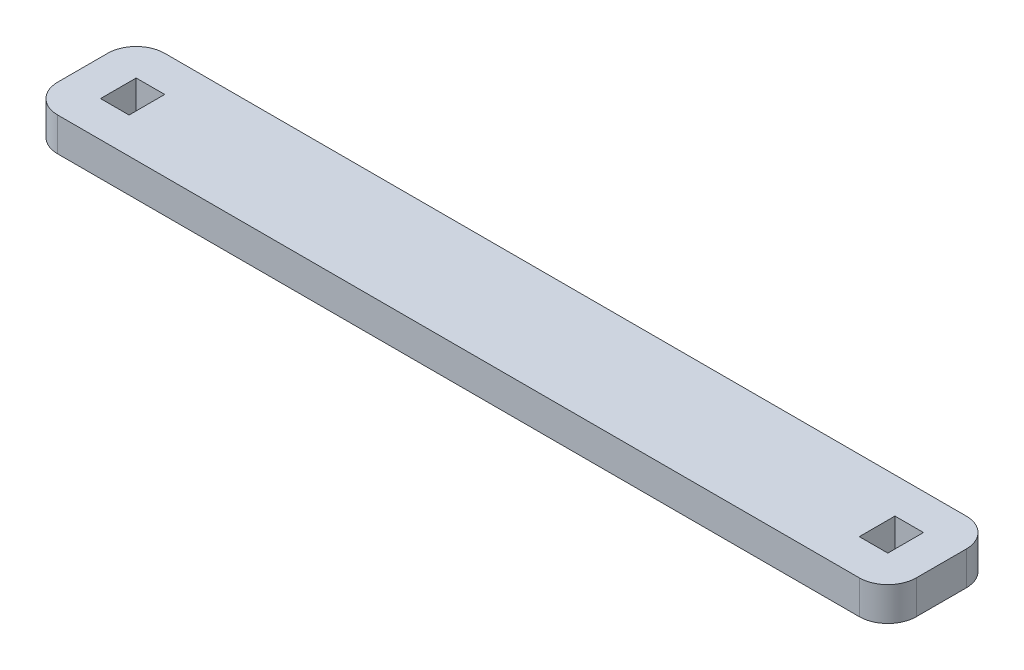
ISO-10303-21;
HEADER;
FILE_DESCRIPTION(('STEP AP214'),'2;1');
FILE_NAME('part.step','',(''),(''),'','','');
FILE_SCHEMA(('AUTOMOTIVE_DESIGN { 1 0 10303 214 1 1 1 1 }'));
ENDSEC;
DATA;
#1=APPLICATION_CONTEXT('core data for automotive mechanical design processes');
#2=APPLICATION_PROTOCOL_DEFINITION('international standard','automotive_design',2000,#1);
#3=PRODUCT_CONTEXT('',#1,'mechanical');
#4=PRODUCT('Part','Part','',(#3));
#5=PRODUCT_RELATED_PRODUCT_CATEGORY('part','',(#4));
#6=PRODUCT_DEFINITION_FORMATION('','',#4);
#7=PRODUCT_DEFINITION_CONTEXT('part definition',#1,'design');
#8=PRODUCT_DEFINITION('design','',#6,#7);
#9=PRODUCT_DEFINITION_SHAPE('','',#8);
#10=(LENGTH_UNIT() NAMED_UNIT(*) SI_UNIT(.MILLI.,.METRE.));
#11=(NAMED_UNIT(*) PLANE_ANGLE_UNIT() SI_UNIT($,.RADIAN.));
#12=(NAMED_UNIT(*) SI_UNIT($,.STERADIAN.) SOLID_ANGLE_UNIT());
#13=UNCERTAINTY_MEASURE_WITH_UNIT(LENGTH_MEASURE(1.E-05),#10,'distance_accuracy_value','');
#14=(GEOMETRIC_REPRESENTATION_CONTEXT(3) GLOBAL_UNCERTAINTY_ASSIGNED_CONTEXT((#13)) GLOBAL_UNIT_ASSIGNED_CONTEXT((#10,
#11,#12)) REPRESENTATION_CONTEXT('',''));
#15=CARTESIAN_POINT('',(0.,0.,0.));
#16=DIRECTION('',(0.,0.,1.));
#17=DIRECTION('',(1.,0.,0.));
#18=AXIS2_PLACEMENT_3D('',#15,#16,#17);
#19=CARTESIAN_POINT('',(0.,1.5,0.));
#20=DIRECTION('',(0.,1.,0.));
#21=DIRECTION('',(0.,0.,1.));
#22=AXIS2_PLACEMENT_3D('',#19,#20,#21);
#23=PLANE('',#22);
#24=DIRECTION('',(-1.,0.,0.));
#25=VECTOR('',#24,1.);
#26=CARTESIAN_POINT('',(38.227,1.5,-4.7625));
#27=LINE('',#26,#25);
#28=CARTESIAN_POINT('',(35.687,1.5,-4.7625));
#29=VERTEX_POINT('',#28);
#30=CARTESIAN_POINT('',(-35.687,1.5,-4.7625));
#31=VERTEX_POINT('',#30);
#32=EDGE_CURVE('E268',#29,#31,#27,.T.);
#33=ORIENTED_EDGE('',*,*,#32,.T.);
#34=CARTESIAN_POINT('',(-35.687,1.5,-2.2225));
#35=DIRECTION('',(0.,1.,0.));
#36=DIRECTION('',(0.,0.,1.));
#37=AXIS2_PLACEMENT_3D('',#34,#35,#36);
#38=CIRCLE('',#37,2.54);
#39=CARTESIAN_POINT('',(-38.227,1.5,-2.2225));
#40=VERTEX_POINT('',#39);
#41=EDGE_CURVE('E319',#31,#40,#38,.T.);
#42=ORIENTED_EDGE('',*,*,#41,.T.);
#43=DIRECTION('',(0.,0.,1.));
#44=VECTOR('',#43,1.);
#45=CARTESIAN_POINT('',(-38.227,1.5,4.7625));
#46=LINE('',#45,#44);
#47=CARTESIAN_POINT('',(-38.227,1.5,2.2225));
#48=VERTEX_POINT('',#47);
#49=EDGE_CURVE('E257',#40,#48,#46,.T.);
#50=ORIENTED_EDGE('',*,*,#49,.T.);
#51=CARTESIAN_POINT('',(-35.687,1.5,2.2225));
#52=DIRECTION('',(0.,1.,0.));
#53=DIRECTION('',(0.,0.,1.));
#54=AXIS2_PLACEMENT_3D('',#51,#52,#53);
#55=CIRCLE('',#54,2.54);
#56=CARTESIAN_POINT('',(-35.687,1.5,4.7625));
#57=VERTEX_POINT('',#56);
#58=EDGE_CURVE('E311',#48,#57,#55,.T.);
#59=ORIENTED_EDGE('',*,*,#58,.T.);
#60=DIRECTION('',(1.,0.,0.));
#61=VECTOR('',#60,1.);
#62=CARTESIAN_POINT('',(38.227,1.5,4.7625));
#63=LINE('',#62,#61);
#64=CARTESIAN_POINT('',(35.687,1.5,4.7625));
#65=VERTEX_POINT('',#64);
#66=EDGE_CURVE('E261',#57,#65,#63,.T.);
#67=ORIENTED_EDGE('',*,*,#66,.T.);
#68=CARTESIAN_POINT('',(35.687,1.5,2.2225));
#69=DIRECTION('',(0.,1.,0.));
#70=DIRECTION('',(0.,0.,1.));
#71=AXIS2_PLACEMENT_3D('',#68,#69,#70);
#72=CIRCLE('',#71,2.54);
#73=CARTESIAN_POINT('',(38.227,1.5,2.2225));
#74=VERTEX_POINT('',#73);
#75=EDGE_CURVE('E68',#65,#74,#72,.T.);
#76=ORIENTED_EDGE('',*,*,#75,.T.);
#77=DIRECTION('',(0.,0.,-1.));
#78=VECTOR('',#77,1.);
#79=CARTESIAN_POINT('',(38.227,1.5,4.7625));
#80=LINE('',#79,#78);
#81=CARTESIAN_POINT('',(38.227,1.5,-2.2225));
#82=VERTEX_POINT('',#81);
#83=EDGE_CURVE('E265',#74,#82,#80,.T.);
#84=ORIENTED_EDGE('',*,*,#83,.T.);
#85=CARTESIAN_POINT('',(35.687,1.5,-2.2225));
#86=DIRECTION('',(0.,1.,0.));
#87=DIRECTION('',(0.,0.,1.));
#88=AXIS2_PLACEMENT_3D('',#85,#86,#87);
#89=CIRCLE('',#88,2.54);
#90=EDGE_CURVE('E316',#82,#29,#89,.T.);
#91=ORIENTED_EDGE('',*,*,#90,.T.);
#92=EDGE_LOOP('',(#33,#42,#50,#59,#67,#76,#84,#91));
#93=FACE_BOUND('',#92,.T.);
#94=DIRECTION('',(1.,0.,0.));
#95=VECTOR('',#94,1.);
#96=CARTESIAN_POINT('',(-32.512,1.5,1.5875));
#97=LINE('',#96,#95);
#98=CARTESIAN_POINT('',(-35.052,1.5,1.5875));
#99=VERTEX_POINT('',#98);
#100=CARTESIAN_POINT('',(-32.512,1.5,1.5875));
#101=VERTEX_POINT('',#100);
#102=EDGE_CURVE('E217',#99,#101,#97,.T.);
#103=ORIENTED_EDGE('',*,*,#102,.F.);
#104=DIRECTION('',(0.,0.,1.));
#105=VECTOR('',#104,1.);
#106=CARTESIAN_POINT('',(-35.052,1.5,1.5875));
#107=LINE('',#106,#105);
#108=CARTESIAN_POINT('',(-35.052,1.5,-1.5875));
#109=VERTEX_POINT('',#108);
#110=EDGE_CURVE('E214',#109,#99,#107,.T.);
#111=ORIENTED_EDGE('',*,*,#110,.F.);
#112=DIRECTION('',(-1.,0.,0.));
#113=VECTOR('',#112,1.);
#114=CARTESIAN_POINT('',(-32.512,1.5,-1.5875));
#115=LINE('',#114,#113);
#116=CARTESIAN_POINT('',(-32.512,1.5,-1.5875));
#117=VERTEX_POINT('',#116);
#118=EDGE_CURVE('E225',#117,#109,#115,.T.);
#119=ORIENTED_EDGE('',*,*,#118,.F.);
#120=DIRECTION('',(0.,0.,-1.));
#121=VECTOR('',#120,1.);
#122=CARTESIAN_POINT('',(-32.512,1.5,1.5875));
#123=LINE('',#122,#121);
#124=EDGE_CURVE('E221',#101,#117,#123,.T.);
#125=ORIENTED_EDGE('',*,*,#124,.F.);
#126=EDGE_LOOP('',(#103,#111,#119,#125));
#127=FACE_BOUND('',#126,.T.);
#128=DIRECTION('',(1.,0.,0.));
#129=VECTOR('',#128,1.);
#130=CARTESIAN_POINT('',(35.052,1.5,1.5875));
#131=LINE('',#130,#129);
#132=CARTESIAN_POINT('',(32.512,1.5,1.5875));
#133=VERTEX_POINT('',#132);
#134=CARTESIAN_POINT('',(35.052,1.5,1.5875));
#135=VERTEX_POINT('',#134);
#136=EDGE_CURVE('E172',#133,#135,#131,.T.);
#137=ORIENTED_EDGE('',*,*,#136,.F.);
#138=DIRECTION('',(0.,0.,1.));
#139=VECTOR('',#138,1.);
#140=CARTESIAN_POINT('',(32.512,1.5,1.5875));
#141=LINE('',#140,#139);
#142=CARTESIAN_POINT('',(32.512,1.5,-1.5875));
#143=VERTEX_POINT('',#142);
#144=EDGE_CURVE('E161',#143,#133,#141,.T.);
#145=ORIENTED_EDGE('',*,*,#144,.F.);
#146=DIRECTION('',(-1.,0.,0.));
#147=VECTOR('',#146,1.);
#148=CARTESIAN_POINT('',(35.052,1.5,-1.5875));
#149=LINE('',#148,#147);
#150=CARTESIAN_POINT('',(35.052,1.5,-1.5875));
#151=VERTEX_POINT('',#150);
#152=EDGE_CURVE('E190',#151,#143,#149,.T.);
#153=ORIENTED_EDGE('',*,*,#152,.F.);
#154=DIRECTION('',(0.,0.,-1.));
#155=VECTOR('',#154,1.);
#156=CARTESIAN_POINT('',(35.052,1.5,1.5875));
#157=LINE('',#156,#155);
#158=EDGE_CURVE('E186',#135,#151,#157,.T.);
#159=ORIENTED_EDGE('',*,*,#158,.F.);
#160=EDGE_LOOP('',(#137,#145,#153,#159));
#161=FACE_BOUND('',#160,.T.);
#162=ADVANCED_FACE('F45',(#93,#127,#161),#23,.T.);
#163=CARTESIAN_POINT('',(0.,-1.5,0.));
#164=DIRECTION('',(0.,1.,0.));
#165=DIRECTION('',(0.,0.,1.));
#166=AXIS2_PLACEMENT_3D('',#163,#164,#165);
#167=PLANE('',#166);
#168=DIRECTION('',(0.,0.,1.));
#169=VECTOR('',#168,1.);
#170=CARTESIAN_POINT('',(-35.052,-1.5,1.5875));
#171=LINE('',#170,#169);
#172=CARTESIAN_POINT('',(-35.052,-1.5,-1.5875));
#173=VERTEX_POINT('',#172);
#174=CARTESIAN_POINT('',(-35.052,-1.5,1.5875));
#175=VERTEX_POINT('',#174);
#176=EDGE_CURVE('E181',#173,#175,#171,.T.);
#177=ORIENTED_EDGE('',*,*,#176,.T.);
#178=DIRECTION('',(1.,0.,0.));
#179=VECTOR('',#178,1.);
#180=CARTESIAN_POINT('',(-32.512,-1.5,1.5875));
#181=LINE('',#180,#179);
#182=CARTESIAN_POINT('',(-32.512,-1.5,1.5875));
#183=VERTEX_POINT('',#182);
#184=EDGE_CURVE('E232',#175,#183,#181,.T.);
#185=ORIENTED_EDGE('',*,*,#184,.T.);
#186=DIRECTION('',(0.,0.,-1.));
#187=VECTOR('',#186,1.);
#188=CARTESIAN_POINT('',(-32.512,-1.5,1.5875));
#189=LINE('',#188,#187);
#190=CARTESIAN_POINT('',(-32.512,-1.5,-1.5875));
#191=VERTEX_POINT('',#190);
#192=EDGE_CURVE('E236',#183,#191,#189,.T.);
#193=ORIENTED_EDGE('',*,*,#192,.T.);
#194=DIRECTION('',(-1.,0.,0.));
#195=VECTOR('',#194,1.);
#196=CARTESIAN_POINT('',(-32.512,-1.5,-1.5875));
#197=LINE('',#196,#195);
#198=EDGE_CURVE('E218',#191,#173,#197,.T.);
#199=ORIENTED_EDGE('',*,*,#198,.T.);
#200=EDGE_LOOP('',(#177,#185,#193,#199));
#201=FACE_BOUND('',#200,.T.);
#202=DIRECTION('',(0.,0.,1.));
#203=VECTOR('',#202,1.);
#204=CARTESIAN_POINT('',(-38.227,-1.5,4.7625));
#205=LINE('',#204,#203);
#206=CARTESIAN_POINT('',(-38.227,-1.5,-2.2225));
#207=VERTEX_POINT('',#206);
#208=CARTESIAN_POINT('',(-38.227,-1.5,2.2225));
#209=VERTEX_POINT('',#208);
#210=EDGE_CURVE('E256',#207,#209,#205,.T.);
#211=ORIENTED_EDGE('',*,*,#210,.F.);
#212=CARTESIAN_POINT('',(-35.687,-1.5,-2.2225));
#213=DIRECTION('',(0.,1.,0.));
#214=DIRECTION('',(0.,0.,1.));
#215=AXIS2_PLACEMENT_3D('',#212,#213,#214);
#216=CIRCLE('',#215,2.54);
#217=CARTESIAN_POINT('',(-35.687,-1.5,-4.7625));
#218=VERTEX_POINT('',#217);
#219=EDGE_CURVE('E301',#207,#218,#216,.F.);
#220=ORIENTED_EDGE('',*,*,#219,.T.);
#221=DIRECTION('',(-1.,0.,0.));
#222=VECTOR('',#221,1.);
#223=CARTESIAN_POINT('',(38.227,-1.5,-4.7625));
#224=LINE('',#223,#222);
#225=CARTESIAN_POINT('',(35.687,-1.5,-4.7625));
#226=VERTEX_POINT('',#225);
#227=EDGE_CURVE('E262',#226,#218,#224,.T.);
#228=ORIENTED_EDGE('',*,*,#227,.F.);
#229=CARTESIAN_POINT('',(35.687,-1.5,-2.2225));
#230=DIRECTION('',(0.,1.,0.));
#231=DIRECTION('',(0.,0.,1.));
#232=AXIS2_PLACEMENT_3D('',#229,#230,#231);
#233=CIRCLE('',#232,2.54);
#234=CARTESIAN_POINT('',(38.227,-1.5,-2.2225));
#235=VERTEX_POINT('',#234);
#236=EDGE_CURVE('E298',#226,#235,#233,.F.);
#237=ORIENTED_EDGE('',*,*,#236,.T.);
#238=DIRECTION('',(0.,0.,-1.));
#239=VECTOR('',#238,1.);
#240=CARTESIAN_POINT('',(38.227,-1.5,4.7625));
#241=LINE('',#240,#239);
#242=CARTESIAN_POINT('',(38.227,-1.5,2.2225));
#243=VERTEX_POINT('',#242);
#244=EDGE_CURVE('E280',#243,#235,#241,.T.);
#245=ORIENTED_EDGE('',*,*,#244,.F.);
#246=CARTESIAN_POINT('',(35.687,-1.5,2.2225));
#247=DIRECTION('',(0.,1.,0.));
#248=DIRECTION('',(0.,0.,1.));
#249=AXIS2_PLACEMENT_3D('',#246,#247,#248);
#250=CIRCLE('',#249,2.54);
#251=CARTESIAN_POINT('',(35.687,-1.5,4.7625));
#252=VERTEX_POINT('',#251);
#253=EDGE_CURVE('E295',#243,#252,#250,.F.);
#254=ORIENTED_EDGE('',*,*,#253,.T.);
#255=DIRECTION('',(1.,0.,0.));
#256=VECTOR('',#255,1.);
#257=CARTESIAN_POINT('',(38.227,-1.5,4.7625));
#258=LINE('',#257,#256);
#259=CARTESIAN_POINT('',(-35.687,-1.5,4.7625));
#260=VERTEX_POINT('',#259);
#261=EDGE_CURVE('E276',#260,#252,#258,.T.);
#262=ORIENTED_EDGE('',*,*,#261,.F.);
#263=CARTESIAN_POINT('',(-35.687,-1.5,2.2225));
#264=DIRECTION('',(0.,1.,0.));
#265=DIRECTION('',(0.,0.,1.));
#266=AXIS2_PLACEMENT_3D('',#263,#264,#265);
#267=CIRCLE('',#266,2.54);
#268=EDGE_CURVE('E292',#260,#209,#267,.F.);
#269=ORIENTED_EDGE('',*,*,#268,.T.);
#270=EDGE_LOOP('',(#211,#220,#228,#237,#245,#254,#262,#269));
#271=FACE_BOUND('',#270,.T.);
#272=DIRECTION('',(0.,0.,1.));
#273=VECTOR('',#272,1.);
#274=CARTESIAN_POINT('',(32.512,-1.5,1.5875));
#275=LINE('',#274,#273);
#276=CARTESIAN_POINT('',(32.512,-1.5,-1.5875));
#277=VERTEX_POINT('',#276);
#278=CARTESIAN_POINT('',(32.512,-1.5,1.5875));
#279=VERTEX_POINT('',#278);
#280=EDGE_CURVE('E195',#277,#279,#275,.T.);
#281=ORIENTED_EDGE('',*,*,#280,.T.);
#282=DIRECTION('',(1.,0.,0.));
#283=VECTOR('',#282,1.);
#284=CARTESIAN_POINT('',(35.052,-1.5,1.5875));
#285=LINE('',#284,#283);
#286=CARTESIAN_POINT('',(35.052,-1.5,1.5875));
#287=VERTEX_POINT('',#286);
#288=EDGE_CURVE('E179',#279,#287,#285,.T.);
#289=ORIENTED_EDGE('',*,*,#288,.T.);
#290=DIRECTION('',(0.,0.,-1.));
#291=VECTOR('',#290,1.);
#292=CARTESIAN_POINT('',(35.052,-1.5,1.5875));
#293=LINE('',#292,#291);
#294=CARTESIAN_POINT('',(35.052,-1.5,-1.5875));
#295=VERTEX_POINT('',#294);
#296=EDGE_CURVE('E200',#287,#295,#293,.T.);
#297=ORIENTED_EDGE('',*,*,#296,.T.);
#298=DIRECTION('',(-1.,0.,0.));
#299=VECTOR('',#298,1.);
#300=CARTESIAN_POINT('',(35.052,-1.5,-1.5875));
#301=LINE('',#300,#299);
#302=EDGE_CURVE('E173',#295,#277,#301,.T.);
#303=ORIENTED_EDGE('',*,*,#302,.T.);
#304=EDGE_LOOP('',(#281,#289,#297,#303));
#305=FACE_BOUND('',#304,.T.);
#306=ADVANCED_FACE('F339',(#201,#271,#305),#167,.F.);
#307=CARTESIAN_POINT('',(-38.227,1.5,4.7625));
#308=DIRECTION('',(1.,0.,0.));
#309=DIRECTION('',(0.,0.,-1.));
#310=AXIS2_PLACEMENT_3D('',#307,#308,#309);
#311=PLANE('',#310);
#312=ORIENTED_EDGE('',*,*,#49,.F.);
#313=DIRECTION('',(0.,-1.,0.));
#314=VECTOR('',#313,1.);
#315=CARTESIAN_POINT('',(-38.227,1.5,-2.2225));
#316=LINE('',#315,#314);
#317=EDGE_CURVE('E288',#40,#207,#316,.T.);
#318=ORIENTED_EDGE('',*,*,#317,.T.);
#319=ORIENTED_EDGE('',*,*,#210,.T.);
#320=DIRECTION('',(0.,-1.,0.));
#321=VECTOR('',#320,1.);
#322=CARTESIAN_POINT('',(-38.227,1.5,2.2225));
#323=LINE('',#322,#321);
#324=EDGE_CURVE('E272',#209,#48,#323,.F.);
#325=ORIENTED_EDGE('',*,*,#324,.T.);
#326=EDGE_LOOP('',(#312,#318,#319,#325));
#327=FACE_BOUND('',#326,.T.);
#328=ADVANCED_FACE('F362',(#327),#311,.F.);
#329=CARTESIAN_POINT('',(38.227,1.5,4.7625));
#330=DIRECTION('',(0.,0.,-1.));
#331=DIRECTION('',(-1.,0.,0.));
#332=AXIS2_PLACEMENT_3D('',#329,#330,#331);
#333=PLANE('',#332);
#334=ORIENTED_EDGE('',*,*,#261,.T.);
#335=DIRECTION('',(0.,-1.,0.));
#336=VECTOR('',#335,1.);
#337=CARTESIAN_POINT('',(35.687,1.5,4.7625));
#338=LINE('',#337,#336);
#339=EDGE_CURVE('E11',#252,#65,#338,.F.);
#340=ORIENTED_EDGE('',*,*,#339,.T.);
#341=ORIENTED_EDGE('',*,*,#66,.F.);
#342=DIRECTION('',(0.,-1.,0.));
#343=VECTOR('',#342,1.);
#344=CARTESIAN_POINT('',(-35.687,1.5,4.7625));
#345=LINE('',#344,#343);
#346=EDGE_CURVE('E54',#57,#260,#345,.T.);
#347=ORIENTED_EDGE('',*,*,#346,.T.);
#348=EDGE_LOOP('',(#334,#340,#341,#347));
#349=FACE_BOUND('',#348,.T.);
#350=ADVANCED_FACE('F333',(#349),#333,.F.);
#351=CARTESIAN_POINT('',(38.227,1.5,4.7625));
#352=DIRECTION('',(-1.,0.,0.));
#353=DIRECTION('',(0.,0.,1.));
#354=AXIS2_PLACEMENT_3D('',#351,#352,#353);
#355=PLANE('',#354);
#356=ORIENTED_EDGE('',*,*,#244,.T.);
#357=DIRECTION('',(0.,-1.,0.));
#358=VECTOR('',#357,1.);
#359=CARTESIAN_POINT('',(38.227,1.5,-2.2225));
#360=LINE('',#359,#358);
#361=EDGE_CURVE('E61',#235,#82,#360,.F.);
#362=ORIENTED_EDGE('',*,*,#361,.T.);
#363=ORIENTED_EDGE('',*,*,#83,.F.);
#364=DIRECTION('',(0.,-1.,0.));
#365=VECTOR('',#364,1.);
#366=CARTESIAN_POINT('',(38.227,1.5,2.2225));
#367=LINE('',#366,#365);
#368=EDGE_CURVE('E322',#74,#243,#367,.T.);
#369=ORIENTED_EDGE('',*,*,#368,.T.);
#370=EDGE_LOOP('',(#356,#362,#363,#369));
#371=FACE_BOUND('',#370,.T.);
#372=ADVANCED_FACE('F345',(#371),#355,.F.);
#373=CARTESIAN_POINT('',(38.227,1.5,-4.7625));
#374=DIRECTION('',(0.,0.,1.));
#375=DIRECTION('',(1.,0.,0.));
#376=AXIS2_PLACEMENT_3D('',#373,#374,#375);
#377=PLANE('',#376);
#378=ORIENTED_EDGE('',*,*,#227,.T.);
#379=DIRECTION('',(0.,-1.,0.));
#380=VECTOR('',#379,1.);
#381=CARTESIAN_POINT('',(-35.687,1.5,-4.7625));
#382=LINE('',#381,#380);
#383=EDGE_CURVE('E308',#218,#31,#382,.F.);
#384=ORIENTED_EDGE('',*,*,#383,.T.);
#385=ORIENTED_EDGE('',*,*,#32,.F.);
#386=DIRECTION('',(0.,-1.,0.));
#387=VECTOR('',#386,1.);
#388=CARTESIAN_POINT('',(35.687,1.5,-4.7625));
#389=LINE('',#388,#387);
#390=EDGE_CURVE('E304',#29,#226,#389,.T.);
#391=ORIENTED_EDGE('',*,*,#390,.T.);
#392=EDGE_LOOP('',(#378,#384,#385,#391));
#393=FACE_BOUND('',#392,.T.);
#394=ADVANCED_FACE('F354',(#393),#377,.F.);
#395=CARTESIAN_POINT('',(-35.052,1.5,1.5875));
#396=DIRECTION('',(1.,0.,0.));
#397=DIRECTION('',(0.,0.,-1.));
#398=AXIS2_PLACEMENT_3D('',#395,#396,#397);
#399=PLANE('',#398);
#400=ORIENTED_EDGE('',*,*,#176,.F.);
#401=DIRECTION('',(0.,-1.,0.));
#402=VECTOR('',#401,1.);
#403=CARTESIAN_POINT('',(-35.052,1.5,-1.5875));
#404=LINE('',#403,#402);
#405=EDGE_CURVE('E228',#109,#173,#404,.T.);
#406=ORIENTED_EDGE('',*,*,#405,.F.);
#407=ORIENTED_EDGE('',*,*,#110,.T.);
#408=DIRECTION('',(0.,-1.,0.));
#409=VECTOR('',#408,1.);
#410=CARTESIAN_POINT('',(-35.052,1.5,1.5875));
#411=LINE('',#410,#409);
#412=EDGE_CURVE('E252',#99,#175,#411,.T.);
#413=ORIENTED_EDGE('',*,*,#412,.T.);
#414=EDGE_LOOP('',(#400,#406,#407,#413));
#415=FACE_BOUND('',#414,.T.);
#416=ADVANCED_FACE('F377',(#415),#399,.T.);
#417=CARTESIAN_POINT('',(-32.512,1.5,1.5875));
#418=DIRECTION('',(0.,0.,-1.));
#419=DIRECTION('',(-1.,0.,0.));
#420=AXIS2_PLACEMENT_3D('',#417,#418,#419);
#421=PLANE('',#420);
#422=ORIENTED_EDGE('',*,*,#184,.F.);
#423=ORIENTED_EDGE('',*,*,#412,.F.);
#424=ORIENTED_EDGE('',*,*,#102,.T.);
#425=DIRECTION('',(0.,-1.,0.));
#426=VECTOR('',#425,1.);
#427=CARTESIAN_POINT('',(-32.512,1.5,1.5875));
#428=LINE('',#427,#426);
#429=EDGE_CURVE('E249',#101,#183,#428,.T.);
#430=ORIENTED_EDGE('',*,*,#429,.T.);
#431=EDGE_LOOP('',(#422,#423,#424,#430));
#432=FACE_BOUND('',#431,.T.);
#433=ADVANCED_FACE('F459',(#432),#421,.T.);
#434=CARTESIAN_POINT('',(-32.512,1.5,1.5875));
#435=DIRECTION('',(-1.,0.,0.));
#436=DIRECTION('',(0.,0.,1.));
#437=AXIS2_PLACEMENT_3D('',#434,#435,#436);
#438=PLANE('',#437);
#439=ORIENTED_EDGE('',*,*,#192,.F.);
#440=ORIENTED_EDGE('',*,*,#429,.F.);
#441=ORIENTED_EDGE('',*,*,#124,.T.);
#442=DIRECTION('',(0.,-1.,0.));
#443=VECTOR('',#442,1.);
#444=CARTESIAN_POINT('',(-32.512,1.5,-1.5875));
#445=LINE('',#444,#443);
#446=EDGE_CURVE('E246',#117,#191,#445,.T.);
#447=ORIENTED_EDGE('',*,*,#446,.T.);
#448=EDGE_LOOP('',(#439,#440,#441,#447));
#449=FACE_BOUND('',#448,.T.);
#450=ADVANCED_FACE('F450',(#449),#438,.T.);
#451=CARTESIAN_POINT('',(-32.512,1.5,-1.5875));
#452=DIRECTION('',(0.,0.,1.));
#453=DIRECTION('',(1.,0.,0.));
#454=AXIS2_PLACEMENT_3D('',#451,#452,#453);
#455=PLANE('',#454);
#456=ORIENTED_EDGE('',*,*,#198,.F.);
#457=ORIENTED_EDGE('',*,*,#446,.F.);
#458=ORIENTED_EDGE('',*,*,#118,.T.);
#459=ORIENTED_EDGE('',*,*,#405,.T.);
#460=EDGE_LOOP('',(#456,#457,#458,#459));
#461=FACE_BOUND('',#460,.T.);
#462=ADVANCED_FACE('F442',(#461),#455,.T.);
#463=CARTESIAN_POINT('',(32.512,1.5,1.5875));
#464=DIRECTION('',(1.,0.,0.));
#465=DIRECTION('',(0.,0.,-1.));
#466=AXIS2_PLACEMENT_3D('',#463,#464,#465);
#467=PLANE('',#466);
#468=ORIENTED_EDGE('',*,*,#280,.F.);
#469=DIRECTION('',(0.,-1.,0.));
#470=VECTOR('',#469,1.);
#471=CARTESIAN_POINT('',(32.512,1.5,-1.5875));
#472=LINE('',#471,#470);
#473=EDGE_CURVE('E167',#143,#277,#472,.T.);
#474=ORIENTED_EDGE('',*,*,#473,.F.);
#475=ORIENTED_EDGE('',*,*,#144,.T.);
#476=DIRECTION('',(0.,-1.,0.));
#477=VECTOR('',#476,1.);
#478=CARTESIAN_POINT('',(32.512,1.5,1.5875));
#479=LINE('',#478,#477);
#480=EDGE_CURVE('E164',#133,#279,#479,.T.);
#481=ORIENTED_EDGE('',*,*,#480,.T.);
#482=EDGE_LOOP('',(#468,#474,#475,#481));
#483=FACE_BOUND('',#482,.T.);
#484=ADVANCED_FACE('F163',(#483),#467,.T.);
#485=CARTESIAN_POINT('',(35.052,1.5,1.5875));
#486=DIRECTION('',(0.,0.,-1.));
#487=DIRECTION('',(-1.,0.,0.));
#488=AXIS2_PLACEMENT_3D('',#485,#486,#487);
#489=PLANE('',#488);
#490=ORIENTED_EDGE('',*,*,#288,.F.);
#491=ORIENTED_EDGE('',*,*,#480,.F.);
#492=ORIENTED_EDGE('',*,*,#136,.T.);
#493=DIRECTION('',(0.,-1.,0.));
#494=VECTOR('',#493,1.);
#495=CARTESIAN_POINT('',(35.052,1.5,1.5875));
#496=LINE('',#495,#494);
#497=EDGE_CURVE('E182',#135,#287,#496,.T.);
#498=ORIENTED_EDGE('',*,*,#497,.T.);
#499=EDGE_LOOP('',(#490,#491,#492,#498));
#500=FACE_BOUND('',#499,.T.);
#501=ADVANCED_FACE('F176',(#500),#489,.T.);
#502=CARTESIAN_POINT('',(35.052,1.5,1.5875));
#503=DIRECTION('',(-1.,0.,0.));
#504=DIRECTION('',(0.,0.,1.));
#505=AXIS2_PLACEMENT_3D('',#502,#503,#504);
#506=PLANE('',#505);
#507=ORIENTED_EDGE('',*,*,#296,.F.);
#508=ORIENTED_EDGE('',*,*,#497,.F.);
#509=ORIENTED_EDGE('',*,*,#158,.T.);
#510=DIRECTION('',(0.,-1.,0.));
#511=VECTOR('',#510,1.);
#512=CARTESIAN_POINT('',(35.052,1.5,-1.5875));
#513=LINE('',#512,#511);
#514=EDGE_CURVE('E209',#151,#295,#513,.T.);
#515=ORIENTED_EDGE('',*,*,#514,.T.);
#516=EDGE_LOOP('',(#507,#508,#509,#515));
#517=FACE_BOUND('',#516,.T.);
#518=ADVANCED_FACE('F418',(#517),#506,.T.);
#519=CARTESIAN_POINT('',(35.052,1.5,-1.5875));
#520=DIRECTION('',(0.,0.,1.));
#521=DIRECTION('',(1.,0.,0.));
#522=AXIS2_PLACEMENT_3D('',#519,#520,#521);
#523=PLANE('',#522);
#524=ORIENTED_EDGE('',*,*,#302,.F.);
#525=ORIENTED_EDGE('',*,*,#514,.F.);
#526=ORIENTED_EDGE('',*,*,#152,.T.);
#527=ORIENTED_EDGE('',*,*,#473,.T.);
#528=EDGE_LOOP('',(#524,#525,#526,#527));
#529=FACE_BOUND('',#528,.T.);
#530=ADVANCED_FACE('F390',(#529),#523,.T.);
#531=CARTESIAN_POINT('',(-35.687,1.5,-2.2225));
#532=DIRECTION('',(0.,-1.,0.));
#533=DIRECTION('',(0.,0.,-1.));
#534=AXIS2_PLACEMENT_3D('',#531,#532,#533);
#535=CYLINDRICAL_SURFACE('',#534,2.54);
#536=ORIENTED_EDGE('',*,*,#41,.F.);
#537=ORIENTED_EDGE('',*,*,#383,.F.);
#538=ORIENTED_EDGE('',*,*,#219,.F.);
#539=ORIENTED_EDGE('',*,*,#317,.F.);
#540=EDGE_LOOP('',(#536,#537,#538,#539));
#541=FACE_BOUND('',#540,.T.);
#542=ADVANCED_FACE('F359',(#541),#535,.T.);
#543=CARTESIAN_POINT('',(35.687,1.5,-2.2225));
#544=DIRECTION('',(0.,-1.,0.));
#545=DIRECTION('',(0.,0.,-1.));
#546=AXIS2_PLACEMENT_3D('',#543,#544,#545);
#547=CYLINDRICAL_SURFACE('',#546,2.54);
#548=ORIENTED_EDGE('',*,*,#90,.F.);
#549=ORIENTED_EDGE('',*,*,#361,.F.);
#550=ORIENTED_EDGE('',*,*,#236,.F.);
#551=ORIENTED_EDGE('',*,*,#390,.F.);
#552=EDGE_LOOP('',(#548,#549,#550,#551));
#553=FACE_BOUND('',#552,.T.);
#554=ADVANCED_FACE('F351',(#553),#547,.T.);
#555=CARTESIAN_POINT('',(35.687,1.5,2.2225));
#556=DIRECTION('',(0.,-1.,0.));
#557=DIRECTION('',(0.,0.,-1.));
#558=AXIS2_PLACEMENT_3D('',#555,#556,#557);
#559=CYLINDRICAL_SURFACE('',#558,2.54);
#560=ORIENTED_EDGE('',*,*,#75,.F.);
#561=ORIENTED_EDGE('',*,*,#339,.F.);
#562=ORIENTED_EDGE('',*,*,#253,.F.);
#563=ORIENTED_EDGE('',*,*,#368,.F.);
#564=EDGE_LOOP('',(#560,#561,#562,#563));
#565=FACE_BOUND('',#564,.T.);
#566=ADVANCED_FACE('F344',(#565),#559,.T.);
#567=CARTESIAN_POINT('',(-35.687,1.5,2.2225));
#568=DIRECTION('',(0.,-1.,0.));
#569=DIRECTION('',(0.,0.,-1.));
#570=AXIS2_PLACEMENT_3D('',#567,#568,#569);
#571=CYLINDRICAL_SURFACE('',#570,2.54);
#572=ORIENTED_EDGE('',*,*,#58,.F.);
#573=ORIENTED_EDGE('',*,*,#324,.F.);
#574=ORIENTED_EDGE('',*,*,#268,.F.);
#575=ORIENTED_EDGE('',*,*,#346,.F.);
#576=EDGE_LOOP('',(#572,#573,#574,#575));
#577=FACE_BOUND('',#576,.T.);
#578=ADVANCED_FACE('F47',(#577),#571,.T.);
#579=CLOSED_SHELL('',(#162,#306,#328,#350,#372,#394,#416,#433,#450,#462,#484,#501,#518,#530,
#542,#554,#566,#578));
#580=MANIFOLD_SOLID_BREP('B2',#579);
#581=ADVANCED_BREP_SHAPE_REPRESENTATION('',(#18,#580),#14);
#582=SHAPE_DEFINITION_REPRESENTATION(#9,#581);
ENDSEC;
END-ISO-10303-21;
